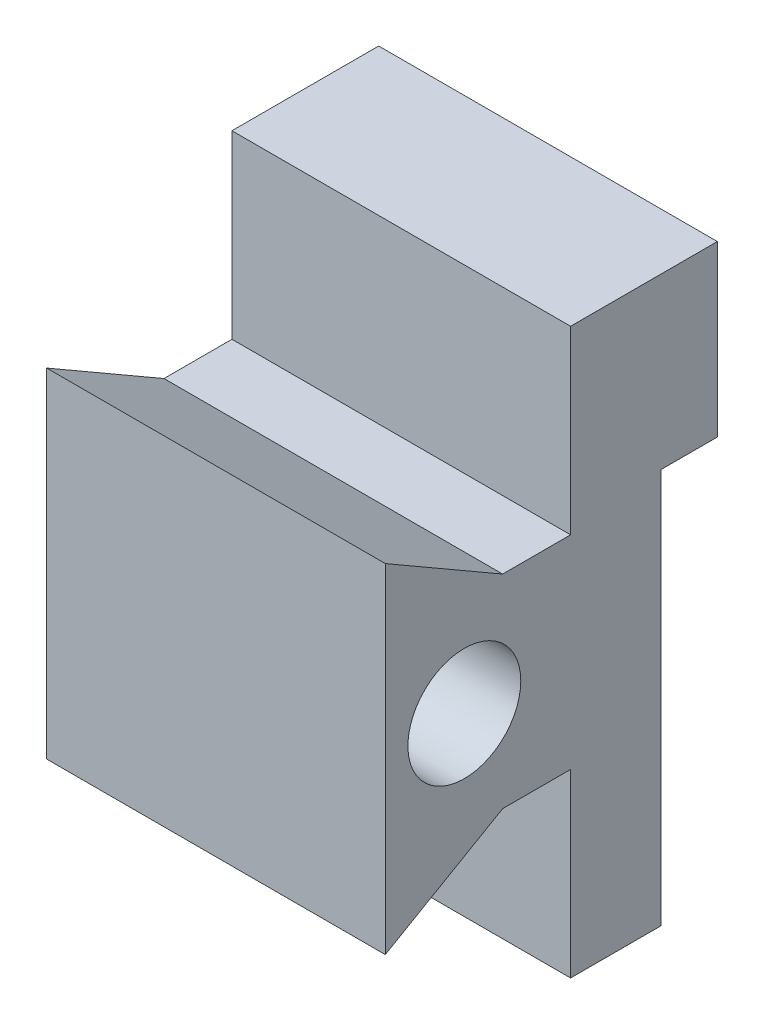
ISO-10303-21;
HEADER;
FILE_DESCRIPTION(('STEP AP214'),'2;1');
FILE_NAME('part.step','',(''),(''),'','','');
FILE_SCHEMA(('AUTOMOTIVE_DESIGN { 1 0 10303 214 1 1 1 1 }'));
ENDSEC;
DATA;
#1=APPLICATION_CONTEXT('core data for automotive mechanical design processes');
#2=APPLICATION_PROTOCOL_DEFINITION('international standard','automotive_design',2000,#1);
#3=PRODUCT_CONTEXT('',#1,'mechanical');
#4=PRODUCT('Part','Part','',(#3));
#5=PRODUCT_RELATED_PRODUCT_CATEGORY('part','',(#4));
#6=PRODUCT_DEFINITION_FORMATION('','',#4);
#7=PRODUCT_DEFINITION_CONTEXT('part definition',#1,'design');
#8=PRODUCT_DEFINITION('design','',#6,#7);
#9=PRODUCT_DEFINITION_SHAPE('','',#8);
#10=(LENGTH_UNIT() NAMED_UNIT(*) SI_UNIT(.MILLI.,.METRE.));
#11=(NAMED_UNIT(*) PLANE_ANGLE_UNIT() SI_UNIT($,.RADIAN.));
#12=(NAMED_UNIT(*) SI_UNIT($,.STERADIAN.) SOLID_ANGLE_UNIT());
#13=UNCERTAINTY_MEASURE_WITH_UNIT(LENGTH_MEASURE(1.E-05),#10,'distance_accuracy_value','');
#14=(GEOMETRIC_REPRESENTATION_CONTEXT(3) GLOBAL_UNCERTAINTY_ASSIGNED_CONTEXT((#13)) GLOBAL_UNIT_ASSIGNED_CONTEXT((#10,
#11,#12)) REPRESENTATION_CONTEXT('',''));
#15=CARTESIAN_POINT('',(0.,0.,0.));
#16=DIRECTION('',(0.,0.,1.));
#17=DIRECTION('',(1.,0.,0.));
#18=AXIS2_PLACEMENT_3D('',#15,#16,#17);
#19=CARTESIAN_POINT('',(3.,2.5,-2.44129041622761));
#20=DIRECTION('',(0.,0.,1.));
#21=DIRECTION('',(1.,0.,0.));
#22=AXIS2_PLACEMENT_3D('',#19,#20,#21);
#23=PLANE('',#22);
#24=DIRECTION('',(-1.,0.,0.));
#25=VECTOR('',#24,1.);
#26=CARTESIAN_POINT('',(3.,1.,-2.44129041622761));
#27=LINE('',#26,#25);
#28=CARTESIAN_POINT('',(3.,1.,-2.44129041622761));
#29=VERTEX_POINT('',#28);
#30=CARTESIAN_POINT('',(0.,1.,-2.44129041622761));
#31=VERTEX_POINT('',#30);
#32=EDGE_CURVE('E50',#29,#31,#27,.T.);
#33=ORIENTED_EDGE('',*,*,#32,.F.);
#34=DIRECTION('',(0.,1.,0.));
#35=VECTOR('',#34,1.);
#36=CARTESIAN_POINT('',(3.,2.5,-2.44129041622761));
#37=LINE('',#36,#35);
#38=CARTESIAN_POINT('',(3.,-2.5,-2.44129041622761));
#39=VERTEX_POINT('',#38);
#40=EDGE_CURVE('E199',#39,#29,#37,.T.);
#41=ORIENTED_EDGE('',*,*,#40,.F.);
#42=DIRECTION('',(-1.,0.,0.));
#43=VECTOR('',#42,1.);
#44=CARTESIAN_POINT('',(3.,-2.5,-2.44129041622761));
#45=LINE('',#44,#43);
#46=CARTESIAN_POINT('',(0.,-2.5,-2.44129041622761));
#47=VERTEX_POINT('',#46);
#48=EDGE_CURVE('E177',#39,#47,#45,.T.);
#49=ORIENTED_EDGE('',*,*,#48,.T.);
#50=DIRECTION('',(0.,1.,0.));
#51=VECTOR('',#50,1.);
#52=CARTESIAN_POINT('',(0.,2.5,-2.44129041622761));
#53=LINE('',#52,#51);
#54=EDGE_CURVE('E160',#47,#31,#53,.T.);
#55=ORIENTED_EDGE('',*,*,#54,.T.);
#56=EDGE_LOOP('',(#33,#41,#49,#55));
#57=FACE_BOUND('',#56,.T.);
#58=ADVANCED_FACE('F35',(#57),#23,.F.);
#59=CARTESIAN_POINT('',(3.,-0.9,-1.03923048454132));
#60=DIRECTION('',(0.,0.866025403784436,0.500000000000004));
#61=DIRECTION('',(0.,-0.500000000000004,0.866025403784436));
#62=AXIS2_PLACEMENT_3D('',#59,#60,#61);
#63=PLANE('',#62);
#64=DIRECTION('',(0.,0.500000000000004,-0.866025403784436));
#65=VECTOR('',#64,1.);
#66=CARTESIAN_POINT('',(0.,-0.9,-1.03923048454132));
#67=LINE('',#66,#65);
#68=CARTESIAN_POINT('',(0.,-1.5,0.));
#69=VERTEX_POINT('',#68);
#70=CARTESIAN_POINT('',(0.,-0.9,-1.03923048454132));
#71=VERTEX_POINT('',#70);
#72=EDGE_CURVE('E150',#69,#71,#67,.T.);
#73=ORIENTED_EDGE('',*,*,#72,.T.);
#74=DIRECTION('',(-1.,0.,0.));
#75=VECTOR('',#74,1.);
#76=CARTESIAN_POINT('',(3.,-0.9,-1.03923048454132));
#77=LINE('',#76,#75);
#78=CARTESIAN_POINT('',(3.,-0.9,-1.03923048454132));
#79=VERTEX_POINT('',#78);
#80=EDGE_CURVE('E11',#79,#71,#77,.T.);
#81=ORIENTED_EDGE('',*,*,#80,.F.);
#82=DIRECTION('',(0.,0.500000000000004,-0.866025403784436));
#83=VECTOR('',#82,1.);
#84=CARTESIAN_POINT('',(3.,-0.9,-1.03923048454132));
#85=LINE('',#84,#83);
#86=CARTESIAN_POINT('',(3.,-1.5,0.));
#87=VERTEX_POINT('',#86);
#88=EDGE_CURVE('E170',#87,#79,#85,.T.);
#89=ORIENTED_EDGE('',*,*,#88,.F.);
#90=DIRECTION('',(-1.,0.,0.));
#91=VECTOR('',#90,1.);
#92=CARTESIAN_POINT('',(3.,-1.5,0.));
#93=LINE('',#92,#91);
#94=EDGE_CURVE('E146',#87,#69,#93,.T.);
#95=ORIENTED_EDGE('',*,*,#94,.T.);
#96=EDGE_LOOP('',(#73,#81,#89,#95));
#97=FACE_BOUND('',#96,.T.);
#98=ADVANCED_FACE('F37',(#97),#63,.F.);
#99=CARTESIAN_POINT('',(3.,-0.9,-1.03923048454132));
#100=DIRECTION('',(0.,1.,0.));
#101=DIRECTION('',(0.,0.,1.));
#102=AXIS2_PLACEMENT_3D('',#99,#100,#101);
#103=PLANE('',#102);
#104=DIRECTION('',(0.,0.,-1.));
#105=VECTOR('',#104,1.);
#106=CARTESIAN_POINT('',(0.,-0.9,-1.03923048454132));
#107=LINE('',#106,#105);
#108=CARTESIAN_POINT('',(0.,-0.9,-1.64129041622761));
#109=VERTEX_POINT('',#108);
#110=EDGE_CURVE('E153',#71,#109,#107,.T.);
#111=ORIENTED_EDGE('',*,*,#110,.T.);
#112=DIRECTION('',(-1.,0.,0.));
#113=VECTOR('',#112,1.);
#114=CARTESIAN_POINT('',(3.,-0.9,-1.64129041622761));
#115=LINE('',#114,#113);
#116=CARTESIAN_POINT('',(3.,-0.9,-1.64129041622761));
#117=VERTEX_POINT('',#116);
#118=EDGE_CURVE('E43',#117,#109,#115,.T.);
#119=ORIENTED_EDGE('',*,*,#118,.F.);
#120=DIRECTION('',(0.,0.,-1.));
#121=VECTOR('',#120,1.);
#122=CARTESIAN_POINT('',(3.,-0.9,-1.03923048454132));
#123=LINE('',#122,#121);
#124=EDGE_CURVE('E103',#79,#117,#123,.T.);
#125=ORIENTED_EDGE('',*,*,#124,.F.);
#126=ORIENTED_EDGE('',*,*,#80,.T.);
#127=EDGE_LOOP('',(#111,#119,#125,#126));
#128=FACE_BOUND('',#127,.T.);
#129=ADVANCED_FACE('F259',(#128),#103,.F.);
#130=CARTESIAN_POINT('',(3.,-0.9,-1.64129041622761));
#131=DIRECTION('',(0.,0.,-1.));
#132=DIRECTION('',(0.,1.,0.));
#133=AXIS2_PLACEMENT_3D('',#130,#131,#132);
#134=PLANE('',#133);
#135=DIRECTION('',(0.,-1.,0.));
#136=VECTOR('',#135,1.);
#137=CARTESIAN_POINT('',(0.,-0.9,-1.64129041622761));
#138=LINE('',#137,#136);
#139=CARTESIAN_POINT('',(0.,-2.5,-1.64129041622761));
#140=VERTEX_POINT('',#139);
#141=EDGE_CURVE('E156',#109,#140,#138,.T.);
#142=ORIENTED_EDGE('',*,*,#141,.T.);
#143=DIRECTION('',(-1.,0.,0.));
#144=VECTOR('',#143,1.);
#145=CARTESIAN_POINT('',(3.,-2.5,-1.64129041622761));
#146=LINE('',#145,#144);
#147=CARTESIAN_POINT('',(3.,-2.5,-1.64129041622761));
#148=VERTEX_POINT('',#147);
#149=EDGE_CURVE('E180',#148,#140,#146,.T.);
#150=ORIENTED_EDGE('',*,*,#149,.F.);
#151=DIRECTION('',(0.,-1.,0.));
#152=VECTOR('',#151,1.);
#153=CARTESIAN_POINT('',(3.,-0.9,-1.64129041622761));
#154=LINE('',#153,#152);
#155=EDGE_CURVE('E188',#117,#148,#154,.T.);
#156=ORIENTED_EDGE('',*,*,#155,.F.);
#157=ORIENTED_EDGE('',*,*,#118,.T.);
#158=EDGE_LOOP('',(#142,#150,#156,#157));
#159=FACE_BOUND('',#158,.T.);
#160=ADVANCED_FACE('F186',(#159),#134,.F.);
#161=CARTESIAN_POINT('',(3.,-2.5,-2.44129041622761));
#162=DIRECTION('',(0.,1.,0.));
#163=DIRECTION('',(0.,0.,1.));
#164=AXIS2_PLACEMENT_3D('',#161,#162,#163);
#165=PLANE('',#164);
#166=DIRECTION('',(0.,0.,-1.));
#167=VECTOR('',#166,1.);
#168=CARTESIAN_POINT('',(0.,-2.5,-2.44129041622761));
#169=LINE('',#168,#167);
#170=EDGE_CURVE('E158',#140,#47,#169,.T.);
#171=ORIENTED_EDGE('',*,*,#170,.T.);
#172=ORIENTED_EDGE('',*,*,#48,.F.);
#173=DIRECTION('',(0.,0.,-1.));
#174=VECTOR('',#173,1.);
#175=CARTESIAN_POINT('',(3.,-2.5,-2.44129041622761));
#176=LINE('',#175,#174);
#177=EDGE_CURVE('E203',#148,#39,#176,.T.);
#178=ORIENTED_EDGE('',*,*,#177,.F.);
#179=ORIENTED_EDGE('',*,*,#149,.T.);
#180=EDGE_LOOP('',(#171,#172,#178,#179));
#181=FACE_BOUND('',#180,.T.);
#182=ADVANCED_FACE('F197',(#181),#165,.F.);
#183=CARTESIAN_POINT('',(3.,2.5,-1.64129041622761));
#184=DIRECTION('',(0.,-1.,0.));
#185=DIRECTION('',(0.,0.,-1.));
#186=AXIS2_PLACEMENT_3D('',#183,#184,#185);
#187=PLANE('',#186);
#188=DIRECTION('',(0.,0.,1.));
#189=VECTOR('',#188,1.);
#190=CARTESIAN_POINT('',(0.,2.5,-1.64129041622761));
#191=LINE('',#190,#189);
#192=CARTESIAN_POINT('',(0.,2.5,-2.94129041622761));
#193=VERTEX_POINT('',#192);
#194=CARTESIAN_POINT('',(0.,2.5,-1.64129041622761));
#195=VERTEX_POINT('',#194);
#196=EDGE_CURVE('E162',#193,#195,#191,.T.);
#197=ORIENTED_EDGE('',*,*,#196,.T.);
#198=DIRECTION('',(-1.,0.,0.));
#199=VECTOR('',#198,1.);
#200=CARTESIAN_POINT('',(3.,2.5,-1.64129041622761));
#201=LINE('',#200,#199);
#202=CARTESIAN_POINT('',(3.,2.5,-1.64129041622761));
#203=VERTEX_POINT('',#202);
#204=EDGE_CURVE('E174',#203,#195,#201,.T.);
#205=ORIENTED_EDGE('',*,*,#204,.F.);
#206=DIRECTION('',(0.,0.,1.));
#207=VECTOR('',#206,1.);
#208=CARTESIAN_POINT('',(3.,2.5,-1.64129041622761));
#209=LINE('',#208,#207);
#210=CARTESIAN_POINT('',(3.,2.5,-2.94129041622761));
#211=VERTEX_POINT('',#210);
#212=EDGE_CURVE('E202',#211,#203,#209,.T.);
#213=ORIENTED_EDGE('',*,*,#212,.F.);
#214=DIRECTION('',(1.,0.,0.));
#215=VECTOR('',#214,1.);
#216=CARTESIAN_POINT('',(3.,2.5,-2.94129041622761));
#217=LINE('',#216,#215);
#218=EDGE_CURVE('E220',#193,#211,#217,.T.);
#219=ORIENTED_EDGE('',*,*,#218,.F.);
#220=EDGE_LOOP('',(#197,#205,#213,#219));
#221=FACE_BOUND('',#220,.T.);
#222=ADVANCED_FACE('F251',(#221),#187,.F.);
#223=CARTESIAN_POINT('',(3.,0.9,-1.64129041622761));
#224=DIRECTION('',(0.,0.,-1.));
#225=DIRECTION('',(0.,1.,0.));
#226=AXIS2_PLACEMENT_3D('',#223,#224,#225);
#227=PLANE('',#226);
#228=DIRECTION('',(0.,-1.,0.));
#229=VECTOR('',#228,1.);
#230=CARTESIAN_POINT('',(0.,0.9,-1.64129041622761));
#231=LINE('',#230,#229);
#232=CARTESIAN_POINT('',(0.,0.9,-1.64129041622761));
#233=VERTEX_POINT('',#232);
#234=EDGE_CURVE('E164',#195,#233,#231,.T.);
#235=ORIENTED_EDGE('',*,*,#234,.T.);
#236=DIRECTION('',(-1.,0.,0.));
#237=VECTOR('',#236,1.);
#238=CARTESIAN_POINT('',(3.,0.9,-1.64129041622761));
#239=LINE('',#238,#237);
#240=CARTESIAN_POINT('',(3.,0.9,-1.64129041622761));
#241=VERTEX_POINT('',#240);
#242=EDGE_CURVE('E141',#241,#233,#239,.T.);
#243=ORIENTED_EDGE('',*,*,#242,.F.);
#244=DIRECTION('',(0.,-1.,0.));
#245=VECTOR('',#244,1.);
#246=CARTESIAN_POINT('',(3.,0.9,-1.64129041622761));
#247=LINE('',#246,#245);
#248=EDGE_CURVE('E129',#203,#241,#247,.T.);
#249=ORIENTED_EDGE('',*,*,#248,.F.);
#250=ORIENTED_EDGE('',*,*,#204,.T.);
#251=EDGE_LOOP('',(#235,#243,#249,#250));
#252=FACE_BOUND('',#251,.T.);
#253=ADVANCED_FACE('F254',(#252),#227,.F.);
#254=CARTESIAN_POINT('',(3.,0.9,-1.03923048454131));
#255=DIRECTION('',(0.,-1.,0.));
#256=DIRECTION('',(0.,0.,-1.));
#257=AXIS2_PLACEMENT_3D('',#254,#255,#256);
#258=PLANE('',#257);
#259=DIRECTION('',(0.,0.,1.));
#260=VECTOR('',#259,1.);
#261=CARTESIAN_POINT('',(0.,0.9,-1.03923048454131));
#262=LINE('',#261,#260);
#263=CARTESIAN_POINT('',(0.,0.9,-1.03923048454131));
#264=VERTEX_POINT('',#263);
#265=EDGE_CURVE('E138',#233,#264,#262,.T.);
#266=ORIENTED_EDGE('',*,*,#265,.T.);
#267=DIRECTION('',(-1.,0.,0.));
#268=VECTOR('',#267,1.);
#269=CARTESIAN_POINT('',(3.,0.9,-1.03923048454131));
#270=LINE('',#269,#268);
#271=CARTESIAN_POINT('',(3.,0.9,-1.03923048454131));
#272=VERTEX_POINT('',#271);
#273=EDGE_CURVE('E135',#272,#264,#270,.T.);
#274=ORIENTED_EDGE('',*,*,#273,.F.);
#275=DIRECTION('',(0.,0.,1.));
#276=VECTOR('',#275,1.);
#277=CARTESIAN_POINT('',(3.,0.9,-1.03923048454131));
#278=LINE('',#277,#276);
#279=EDGE_CURVE('E122',#241,#272,#278,.T.);
#280=ORIENTED_EDGE('',*,*,#279,.F.);
#281=ORIENTED_EDGE('',*,*,#242,.T.);
#282=EDGE_LOOP('',(#266,#274,#280,#281));
#283=FACE_BOUND('',#282,.T.);
#284=ADVANCED_FACE('F136',(#283),#258,.F.);
#285=CARTESIAN_POINT('',(3.,1.5,0.));
#286=DIRECTION('',(0.,-0.866025403784436,0.500000000000004));
#287=DIRECTION('',(0.,-0.500000000000004,-0.866025403784436));
#288=AXIS2_PLACEMENT_3D('',#285,#286,#287);
#289=PLANE('',#288);
#290=DIRECTION('',(0.,0.500000000000004,0.866025403784436));
#291=VECTOR('',#290,1.);
#292=CARTESIAN_POINT('',(0.,1.5,0.));
#293=LINE('',#292,#291);
#294=CARTESIAN_POINT('',(0.,1.5,0.));
#295=VERTEX_POINT('',#294);
#296=EDGE_CURVE('E167',#264,#295,#293,.T.);
#297=ORIENTED_EDGE('',*,*,#296,.T.);
#298=DIRECTION('',(-1.,0.,0.));
#299=VECTOR('',#298,1.);
#300=CARTESIAN_POINT('',(3.,1.5,0.));
#301=LINE('',#300,#299);
#302=CARTESIAN_POINT('',(3.,1.5,0.));
#303=VERTEX_POINT('',#302);
#304=EDGE_CURVE('E142',#303,#295,#301,.T.);
#305=ORIENTED_EDGE('',*,*,#304,.F.);
#306=DIRECTION('',(0.,0.500000000000004,0.866025403784436));
#307=VECTOR('',#306,1.);
#308=CARTESIAN_POINT('',(3.,1.5,0.));
#309=LINE('',#308,#307);
#310=EDGE_CURVE('E126',#272,#303,#309,.T.);
#311=ORIENTED_EDGE('',*,*,#310,.F.);
#312=ORIENTED_EDGE('',*,*,#273,.T.);
#313=EDGE_LOOP('',(#297,#305,#311,#312));
#314=FACE_BOUND('',#313,.T.);
#315=ADVANCED_FACE('F144',(#314),#289,.F.);
#316=CARTESIAN_POINT('',(3.,-1.5,0.));
#317=DIRECTION('',(0.,0.,-1.));
#318=DIRECTION('',(-1.,0.,0.));
#319=AXIS2_PLACEMENT_3D('',#316,#317,#318);
#320=PLANE('',#319);
#321=DIRECTION('',(0.,-1.,0.));
#322=VECTOR('',#321,1.);
#323=CARTESIAN_POINT('',(0.,-1.5,0.));
#324=LINE('',#323,#322);
#325=EDGE_CURVE('E95',#295,#69,#324,.T.);
#326=ORIENTED_EDGE('',*,*,#325,.T.);
#327=ORIENTED_EDGE('',*,*,#94,.F.);
#328=DIRECTION('',(0.,-1.,0.));
#329=VECTOR('',#328,1.);
#330=CARTESIAN_POINT('',(3.,-1.5,0.));
#331=LINE('',#330,#329);
#332=EDGE_CURVE('E59',#303,#87,#331,.T.);
#333=ORIENTED_EDGE('',*,*,#332,.F.);
#334=ORIENTED_EDGE('',*,*,#304,.T.);
#335=EDGE_LOOP('',(#326,#327,#333,#334));
#336=FACE_BOUND('',#335,.T.);
#337=ADVANCED_FACE('F255',(#336),#320,.F.);
#338=CARTESIAN_POINT('',(3.,0.,0.));
#339=DIRECTION('',(-1.,0.,0.));
#340=DIRECTION('',(0.,0.,1.));
#341=AXIS2_PLACEMENT_3D('',#338,#339,#340);
#342=PLANE('',#341);
#343=CARTESIAN_POINT('',(3.,0.,-0.7));
#344=DIRECTION('',(1.,0.,0.));
#345=DIRECTION('',(0.,0.,-1.));
#346=AXIS2_PLACEMENT_3D('',#343,#344,#345);
#347=CIRCLE('',#346,0.500000000000001);
#348=CARTESIAN_POINT('',(3.,0.,-1.2));
#349=VERTEX_POINT('',#348);
#350=EDGE_CURVE('E211',#349,#349,#347,.T.);
#351=ORIENTED_EDGE('',*,*,#350,.F.);
#352=EDGE_LOOP('',(#351));
#353=FACE_BOUND('',#352,.T.);
#354=ORIENTED_EDGE('',*,*,#88,.T.);
#355=ORIENTED_EDGE('',*,*,#124,.T.);
#356=ORIENTED_EDGE('',*,*,#155,.T.);
#357=ORIENTED_EDGE('',*,*,#177,.T.);
#358=ORIENTED_EDGE('',*,*,#40,.T.);
#359=DIRECTION('',(0.,0.,1.));
#360=VECTOR('',#359,1.);
#361=CARTESIAN_POINT('',(3.,1.,-2.94129041622761));
#362=LINE('',#361,#360);
#363=CARTESIAN_POINT('',(3.,1.,-2.94129041622761));
#364=VERTEX_POINT('',#363);
#365=EDGE_CURVE('E214',#364,#29,#362,.T.);
#366=ORIENTED_EDGE('',*,*,#365,.F.);
#367=DIRECTION('',(0.,-1.,0.));
#368=VECTOR('',#367,1.);
#369=CARTESIAN_POINT('',(3.,2.5,-2.94129041622761));
#370=LINE('',#369,#368);
#371=EDGE_CURVE('E222',#211,#364,#370,.T.);
#372=ORIENTED_EDGE('',*,*,#371,.F.);
#373=ORIENTED_EDGE('',*,*,#212,.T.);
#374=ORIENTED_EDGE('',*,*,#248,.T.);
#375=ORIENTED_EDGE('',*,*,#279,.T.);
#376=ORIENTED_EDGE('',*,*,#310,.T.);
#377=ORIENTED_EDGE('',*,*,#332,.T.);
#378=EDGE_LOOP('',(#354,#355,#356,#357,#358,#366,#372,#373,#374,#375,#376,#377));
#379=FACE_BOUND('',#378,.T.);
#380=ADVANCED_FACE('F124',(#353,#379),#342,.F.);
#381=CARTESIAN_POINT('',(0.,0.,0.));
#382=DIRECTION('',(-1.,0.,0.));
#383=DIRECTION('',(0.,0.,1.));
#384=AXIS2_PLACEMENT_3D('',#381,#382,#383);
#385=PLANE('',#384);
#386=CARTESIAN_POINT('',(0.,0.,-0.7));
#387=DIRECTION('',(1.,0.,0.));
#388=DIRECTION('',(0.,0.,-1.));
#389=AXIS2_PLACEMENT_3D('',#386,#387,#388);
#390=CIRCLE('',#389,0.500000000000001);
#391=CARTESIAN_POINT('',(0.,0.,-1.2));
#392=VERTEX_POINT('',#391);
#393=EDGE_CURVE('E154',#392,#392,#390,.T.);
#394=ORIENTED_EDGE('',*,*,#393,.T.);
#395=EDGE_LOOP('',(#394));
#396=FACE_BOUND('',#395,.T.);
#397=ORIENTED_EDGE('',*,*,#72,.F.);
#398=ORIENTED_EDGE('',*,*,#325,.F.);
#399=ORIENTED_EDGE('',*,*,#296,.F.);
#400=ORIENTED_EDGE('',*,*,#265,.F.);
#401=ORIENTED_EDGE('',*,*,#234,.F.);
#402=ORIENTED_EDGE('',*,*,#196,.F.);
#403=DIRECTION('',(0.,1.,0.));
#404=VECTOR('',#403,1.);
#405=CARTESIAN_POINT('',(0.,2.5,-2.94129041622761));
#406=LINE('',#405,#404);
#407=CARTESIAN_POINT('',(0.,1.,-2.94129041622761));
#408=VERTEX_POINT('',#407);
#409=EDGE_CURVE('E225',#408,#193,#406,.T.);
#410=ORIENTED_EDGE('',*,*,#409,.F.);
#411=DIRECTION('',(0.,0.,1.));
#412=VECTOR('',#411,1.);
#413=CARTESIAN_POINT('',(0.,1.,-2.94129041622761));
#414=LINE('',#413,#412);
#415=EDGE_CURVE('E218',#408,#31,#414,.T.);
#416=ORIENTED_EDGE('',*,*,#415,.T.);
#417=ORIENTED_EDGE('',*,*,#54,.F.);
#418=ORIENTED_EDGE('',*,*,#170,.F.);
#419=ORIENTED_EDGE('',*,*,#141,.F.);
#420=ORIENTED_EDGE('',*,*,#110,.F.);
#421=EDGE_LOOP('',(#397,#398,#399,#400,#401,#402,#410,#416,#417,#418,#419,#420));
#422=FACE_BOUND('',#421,.T.);
#423=ADVANCED_FACE('F192',(#396,#422),#385,.T.);
#424=CARTESIAN_POINT('',(0.,0.,-0.7));
#425=DIRECTION('',(1.,0.,0.));
#426=DIRECTION('',(0.,0.,-1.));
#427=AXIS2_PLACEMENT_3D('',#424,#425,#426);
#428=CYLINDRICAL_SURFACE('',#427,0.500000000000001);
#429=ORIENTED_EDGE('',*,*,#393,.F.);
#430=EDGE_LOOP('',(#429));
#431=FACE_BOUND('',#430,.T.);
#432=ORIENTED_EDGE('',*,*,#350,.T.);
#433=EDGE_LOOP('',(#432));
#434=FACE_BOUND('',#433,.T.);
#435=ADVANCED_FACE('F294',(#431,#434),#428,.F.);
#436=CARTESIAN_POINT('',(3.,1.,-2.94129041622761));
#437=DIRECTION('',(0.,1.,0.));
#438=DIRECTION('',(0.,0.,1.));
#439=AXIS2_PLACEMENT_3D('',#436,#437,#438);
#440=PLANE('',#439);
#441=ORIENTED_EDGE('',*,*,#32,.T.);
#442=ORIENTED_EDGE('',*,*,#415,.F.);
#443=DIRECTION('',(-1.,0.,0.));
#444=VECTOR('',#443,1.);
#445=CARTESIAN_POINT('',(3.,1.,-2.94129041622761));
#446=LINE('',#445,#444);
#447=EDGE_CURVE('E228',#364,#408,#446,.T.);
#448=ORIENTED_EDGE('',*,*,#447,.F.);
#449=ORIENTED_EDGE('',*,*,#365,.T.);
#450=EDGE_LOOP('',(#441,#442,#448,#449));
#451=FACE_BOUND('',#450,.T.);
#452=ADVANCED_FACE('F242',(#451),#440,.F.);
#453=CARTESIAN_POINT('',(0.,0.,-2.94129041622761));
#454=DIRECTION('',(0.,0.,-1.));
#455=DIRECTION('',(-1.,0.,0.));
#456=AXIS2_PLACEMENT_3D('',#453,#454,#455);
#457=PLANE('',#456);
#458=ORIENTED_EDGE('',*,*,#371,.T.);
#459=ORIENTED_EDGE('',*,*,#447,.T.);
#460=ORIENTED_EDGE('',*,*,#409,.T.);
#461=ORIENTED_EDGE('',*,*,#218,.T.);
#462=EDGE_LOOP('',(#458,#459,#460,#461));
#463=FACE_BOUND('',#462,.T.);
#464=ADVANCED_FACE('F235',(#463),#457,.T.);
#465=CLOSED_SHELL('',(#58,#98,#129,#160,#182,#222,#253,#284,#315,#337,#380,#423,#435,#452,#464));
#466=MANIFOLD_SOLID_BREP('B2',#465);
#467=ADVANCED_BREP_SHAPE_REPRESENTATION('',(#18,#466),#14);
#468=SHAPE_DEFINITION_REPRESENTATION(#9,#467);
ENDSEC;
END-ISO-10303-21;
